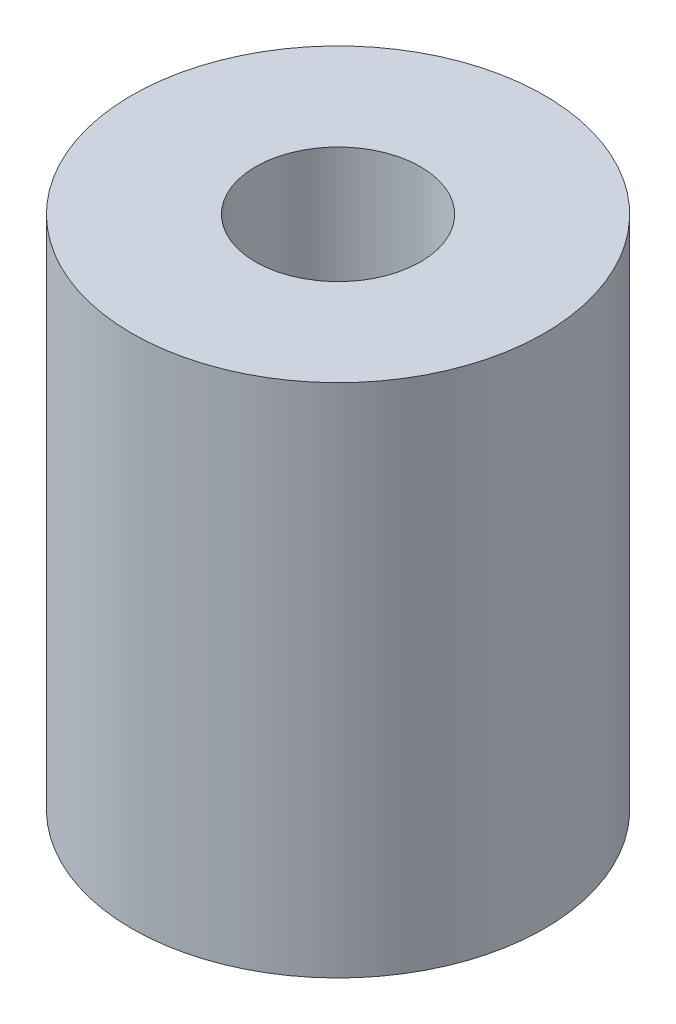
ISO-10303-21;
HEADER;
FILE_DESCRIPTION(('STEP AP214'),'2;1');
FILE_NAME('part.step','',(''),(''),'','','');
FILE_SCHEMA(('AUTOMOTIVE_DESIGN { 1 0 10303 214 1 1 1 1 }'));
ENDSEC;
DATA;
#1=APPLICATION_CONTEXT('core data for automotive mechanical design processes');
#2=APPLICATION_PROTOCOL_DEFINITION('international standard','automotive_design',2000,#1);
#3=PRODUCT_CONTEXT('',#1,'mechanical');
#4=PRODUCT('Part','Part','',(#3));
#5=PRODUCT_RELATED_PRODUCT_CATEGORY('part','',(#4));
#6=PRODUCT_DEFINITION_FORMATION('','',#4);
#7=PRODUCT_DEFINITION_CONTEXT('part definition',#1,'design');
#8=PRODUCT_DEFINITION('design','',#6,#7);
#9=PRODUCT_DEFINITION_SHAPE('','',#8);
#10=(LENGTH_UNIT() NAMED_UNIT(*) SI_UNIT(.MILLI.,.METRE.));
#11=(NAMED_UNIT(*) PLANE_ANGLE_UNIT() SI_UNIT($,.RADIAN.));
#12=(NAMED_UNIT(*) SI_UNIT($,.STERADIAN.) SOLID_ANGLE_UNIT());
#13=UNCERTAINTY_MEASURE_WITH_UNIT(LENGTH_MEASURE(1.E-05),#10,'distance_accuracy_value','');
#14=(GEOMETRIC_REPRESENTATION_CONTEXT(3) GLOBAL_UNCERTAINTY_ASSIGNED_CONTEXT((#13)) GLOBAL_UNIT_ASSIGNED_CONTEXT((#10,
#11,#12)) REPRESENTATION_CONTEXT('',''));
#15=CARTESIAN_POINT('',(0.,0.,0.));
#16=DIRECTION('',(0.,0.,1.));
#17=DIRECTION('',(1.,0.,0.));
#18=AXIS2_PLACEMENT_3D('',#15,#16,#17);
#19=CARTESIAN_POINT('',(0.,25.,0.));
#20=DIRECTION('',(0.,1.,0.));
#21=DIRECTION('',(0.,0.,1.));
#22=AXIS2_PLACEMENT_3D('',#19,#20,#21);
#23=PLANE('',#22);
#24=CARTESIAN_POINT('',(0.,25.,0.));
#25=DIRECTION('',(0.,1.,0.));
#26=DIRECTION('',(0.,0.,1.));
#27=AXIS2_PLACEMENT_3D('',#24,#25,#26);
#28=CIRCLE('',#27,10.);
#29=CARTESIAN_POINT('',(0.,25.,10.));
#30=VERTEX_POINT('',#29);
#31=EDGE_CURVE('E10',#30,#30,#28,.T.);
#32=ORIENTED_EDGE('',*,*,#31,.T.);
#33=EDGE_LOOP('',(#32));
#34=FACE_BOUND('',#33,.T.);
#35=CARTESIAN_POINT('',(0.,25.,0.));
#36=DIRECTION('',(0.,1.,0.));
#37=DIRECTION('',(0.,0.,1.));
#38=AXIS2_PLACEMENT_3D('',#35,#36,#37);
#39=CIRCLE('',#38,4.);
#40=CARTESIAN_POINT('',(0.,25.,4.));
#41=VERTEX_POINT('',#40);
#42=EDGE_CURVE('E57',#41,#41,#39,.T.);
#43=ORIENTED_EDGE('',*,*,#42,.F.);
#44=EDGE_LOOP('',(#43));
#45=FACE_BOUND('',#44,.T.);
#46=ADVANCED_FACE('F43',(#34,#45),#23,.T.);
#47=CARTESIAN_POINT('',(0.,0.,0.));
#48=DIRECTION('',(0.,1.,0.));
#49=DIRECTION('',(0.,0.,1.));
#50=AXIS2_PLACEMENT_3D('',#47,#48,#49);
#51=PLANE('',#50);
#52=CARTESIAN_POINT('',(0.,0.,0.));
#53=DIRECTION('',(0.,1.,0.));
#54=DIRECTION('',(0.,0.,1.));
#55=AXIS2_PLACEMENT_3D('',#52,#53,#54);
#56=CIRCLE('',#55,10.);
#57=CARTESIAN_POINT('',(0.,0.,10.));
#58=VERTEX_POINT('',#57);
#59=EDGE_CURVE('E50',#58,#58,#56,.T.);
#60=ORIENTED_EDGE('',*,*,#59,.F.);
#61=EDGE_LOOP('',(#60));
#62=FACE_BOUND('',#61,.T.);
#63=CARTESIAN_POINT('',(0.,0.,0.));
#64=DIRECTION('',(0.,1.,0.));
#65=DIRECTION('',(0.,0.,1.));
#66=AXIS2_PLACEMENT_3D('',#63,#64,#65);
#67=CIRCLE('',#66,4.);
#68=CARTESIAN_POINT('',(0.,0.,4.));
#69=VERTEX_POINT('',#68);
#70=EDGE_CURVE('E59',#69,#69,#67,.T.);
#71=ORIENTED_EDGE('',*,*,#70,.T.);
#72=EDGE_LOOP('',(#71));
#73=FACE_BOUND('',#72,.T.);
#74=ADVANCED_FACE('F68',(#62,#73),#51,.F.);
#75=CARTESIAN_POINT('',(0.,25.,0.));
#76=DIRECTION('',(0.,-1.,0.));
#77=DIRECTION('',(0.,0.,-1.));
#78=AXIS2_PLACEMENT_3D('',#75,#76,#77);
#79=CYLINDRICAL_SURFACE('',#78,10.);
#80=ORIENTED_EDGE('',*,*,#31,.F.);
#81=EDGE_LOOP('',(#80));
#82=FACE_BOUND('',#81,.T.);
#83=ORIENTED_EDGE('',*,*,#59,.T.);
#84=EDGE_LOOP('',(#83));
#85=FACE_BOUND('',#84,.T.);
#86=ADVANCED_FACE('F44',(#82,#85),#79,.T.);
#87=CARTESIAN_POINT('',(0.,25.,0.));
#88=DIRECTION('',(0.,-1.,0.));
#89=DIRECTION('',(0.,0.,-1.));
#90=AXIS2_PLACEMENT_3D('',#87,#88,#89);
#91=CYLINDRICAL_SURFACE('',#90,4.);
#92=ORIENTED_EDGE('',*,*,#42,.T.);
#93=EDGE_LOOP('',(#92));
#94=FACE_BOUND('',#93,.T.);
#95=ORIENTED_EDGE('',*,*,#70,.F.);
#96=EDGE_LOOP('',(#95));
#97=FACE_BOUND('',#96,.T.);
#98=ADVANCED_FACE('F67',(#94,#97),#91,.F.);
#99=CLOSED_SHELL('',(#46,#74,#86,#98));
#100=MANIFOLD_SOLID_BREP('B2',#99);
#101=ADVANCED_BREP_SHAPE_REPRESENTATION('',(#18,#100),#14);
#102=SHAPE_DEFINITION_REPRESENTATION(#9,#101);
ENDSEC;
END-ISO-10303-21;
